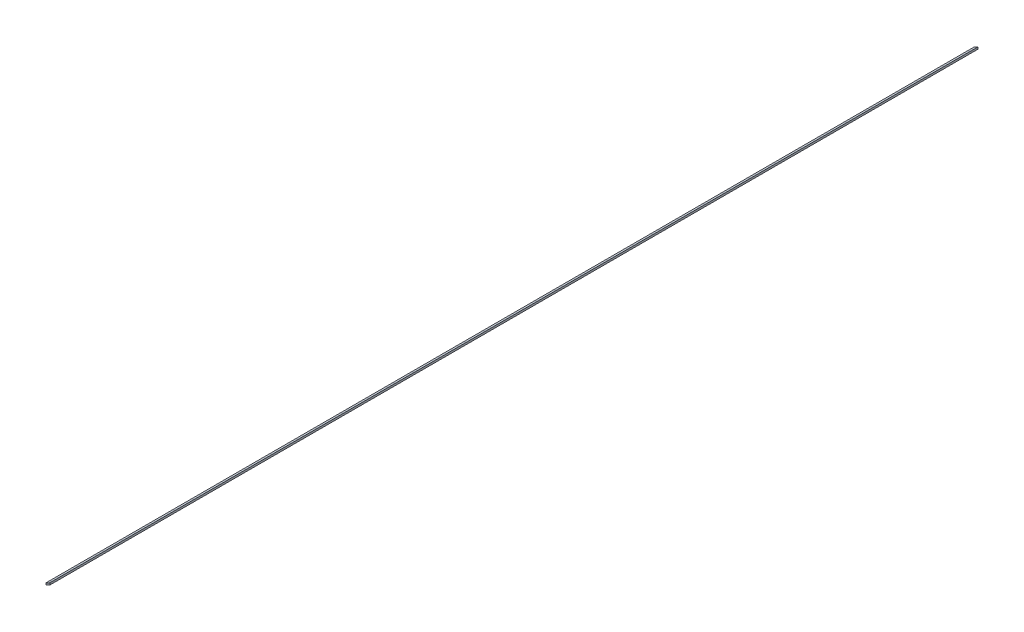
ISO-10303-21;
HEADER;
FILE_DESCRIPTION(('STEP AP214'),'2;1');
FILE_NAME('part.step','',(''),(''),'','','');
FILE_SCHEMA(('AUTOMOTIVE_DESIGN { 1 0 10303 214 1 1 1 1 }'));
ENDSEC;
DATA;
#1=APPLICATION_CONTEXT('core data for automotive mechanical design processes');
#2=APPLICATION_PROTOCOL_DEFINITION('international standard','automotive_design',2000,#1);
#3=PRODUCT_CONTEXT('',#1,'mechanical');
#4=PRODUCT('Part','Part','',(#3));
#5=PRODUCT_RELATED_PRODUCT_CATEGORY('part','',(#4));
#6=PRODUCT_DEFINITION_FORMATION('','',#4);
#7=PRODUCT_DEFINITION_CONTEXT('part definition',#1,'design');
#8=PRODUCT_DEFINITION('design','',#6,#7);
#9=PRODUCT_DEFINITION_SHAPE('','',#8);
#10=(LENGTH_UNIT() NAMED_UNIT(*) SI_UNIT(.MILLI.,.METRE.));
#11=(NAMED_UNIT(*) PLANE_ANGLE_UNIT() SI_UNIT($,.RADIAN.));
#12=(NAMED_UNIT(*) SI_UNIT($,.STERADIAN.) SOLID_ANGLE_UNIT());
#13=UNCERTAINTY_MEASURE_WITH_UNIT(LENGTH_MEASURE(1.E-05),#10,'distance_accuracy_value','');
#14=(GEOMETRIC_REPRESENTATION_CONTEXT(3) GLOBAL_UNCERTAINTY_ASSIGNED_CONTEXT((#13)) GLOBAL_UNIT_ASSIGNED_CONTEXT((#10,
#11,#12)) REPRESENTATION_CONTEXT('',''));
#15=CARTESIAN_POINT('',(0.,0.,0.));
#16=DIRECTION('',(0.,0.,1.));
#17=DIRECTION('',(1.,0.,0.));
#18=AXIS2_PLACEMENT_3D('',#15,#16,#17);
#19=CARTESIAN_POINT('',(12192.,10868.8293766007,-12192.));
#20=DIRECTION('',(0.,0.,1.));
#21=DIRECTION('',(1.,0.,0.));
#22=AXIS2_PLACEMENT_3D('',#19,#20,#21);
#23=PLANE('',#22);
#24=DIRECTION('',(0.888496348848055,0.458883686879013,0.));
#25=VECTOR('',#24,1.);
#26=CARTESIAN_POINT('',(-50.8,4572.,-12192.));
#27=LINE('',#26,#25);
#28=CARTESIAN_POINT('',(-50.8,4572.,-12192.));
#29=VERTEX_POINT('',#28);
#30=CARTESIAN_POINT('',(0.,4598.23678906917,-12192.));
#31=VERTEX_POINT('',#30);
#32=EDGE_CURVE('E88',#29,#31,#27,.T.);
#33=ORIENTED_EDGE('',*,*,#32,.T.);
#34=DIRECTION('',(0.,-1.,0.));
#35=VECTOR('',#34,1.);
#36=CARTESIAN_POINT('',(0.,50.8,-12192.));
#37=LINE('',#36,#35);
#38=CARTESIAN_POINT('',(4.7679880361686E-12,4572.,-12192.));
#39=VERTEX_POINT('',#38);
#40=EDGE_CURVE('E38',#31,#39,#37,.T.);
#41=ORIENTED_EDGE('',*,*,#40,.T.);
#42=DIRECTION('',(0.888496348848055,0.458883686879013,0.));
#43=VECTOR('',#42,1.);
#44=CARTESIAN_POINT('',(12192.,10868.8293766007,-12192.));
#45=LINE('',#44,#43);
#46=CARTESIAN_POINT('',(-50.8000000000003,4545.76321093083,-12192.));
#47=VERTEX_POINT('',#46);
#48=EDGE_CURVE('E11',#47,#39,#45,.T.);
#49=ORIENTED_EDGE('',*,*,#48,.F.);
#50=DIRECTION('',(0.,-1.,0.));
#51=VECTOR('',#50,1.);
#52=CARTESIAN_POINT('',(-50.8,0.,-12192.));
#53=LINE('',#52,#51);
#54=EDGE_CURVE('E97',#29,#47,#53,.T.);
#55=ORIENTED_EDGE('',*,*,#54,.F.);
#56=EDGE_LOOP('',(#33,#41,#49,#55));
#57=FACE_BOUND('',#56,.T.);
#58=ADVANCED_FACE('F34',(#57),#23,.F.);
#59=CARTESIAN_POINT('',(0.,50.8,-12192.));
#60=DIRECTION('',(1.,0.,0.));
#61=DIRECTION('',(0.,0.,-1.));
#62=AXIS2_PLACEMENT_3D('',#59,#60,#61);
#63=PLANE('',#62);
#64=DIRECTION('',(0.,0.,-1.));
#65=VECTOR('',#64,1.);
#66=CARTESIAN_POINT('',(0.,4598.23678906917,-26022.0350141595));
#67=LINE('',#66,#65);
#68=CARTESIAN_POINT('',(0.,4598.23678906917,0.));
#69=VERTEX_POINT('',#68);
#70=EDGE_CURVE('E59',#69,#31,#67,.T.);
#71=ORIENTED_EDGE('',*,*,#70,.F.);
#72=DIRECTION('',(0.,-1.,0.));
#73=VECTOR('',#72,1.);
#74=CARTESIAN_POINT('',(0.,50.8,0.));
#75=LINE('',#74,#73);
#76=CARTESIAN_POINT('',(0.,4572.,0.));
#77=VERTEX_POINT('',#76);
#78=EDGE_CURVE('E90',#69,#77,#75,.T.);
#79=ORIENTED_EDGE('',*,*,#78,.T.);
#80=DIRECTION('',(0.,0.,-1.));
#81=VECTOR('',#80,1.);
#82=CARTESIAN_POINT('',(0.,4572.,-12192.));
#83=LINE('',#82,#81);
#84=EDGE_CURVE('E83',#77,#39,#83,.T.);
#85=ORIENTED_EDGE('',*,*,#84,.T.);
#86=ORIENTED_EDGE('',*,*,#40,.F.);
#87=EDGE_LOOP('',(#71,#79,#85,#86));
#88=FACE_BOUND('',#87,.T.);
#89=ADVANCED_FACE('F89',(#88),#63,.T.);
#90=CARTESIAN_POINT('',(4.7679880361686E-12,4572.,-12192.));
#91=DIRECTION('',(0.458883686879013,-0.888496348848055,0.));
#92=DIRECTION('',(0.888496348848055,0.458883686879013,0.));
#93=AXIS2_PLACEMENT_3D('',#90,#91,#92);
#94=PLANE('',#93);
#95=ORIENTED_EDGE('',*,*,#84,.F.);
#96=DIRECTION('',(-0.888496348848055,-0.458883686879013,0.));
#97=VECTOR('',#96,1.);
#98=CARTESIAN_POINT('',(-1843.36775090388,3619.95175477608,0.));
#99=LINE('',#98,#97);
#100=CARTESIAN_POINT('',(-50.8,4545.76321093083,0.));
#101=VERTEX_POINT('',#100);
#102=EDGE_CURVE('E95',#77,#101,#99,.T.);
#103=ORIENTED_EDGE('',*,*,#102,.T.);
#104=DIRECTION('',(0.,0.,-1.));
#105=VECTOR('',#104,1.);
#106=CARTESIAN_POINT('',(-50.8,4545.76321093083,0.));
#107=LINE('',#106,#105);
#108=EDGE_CURVE('E84',#101,#47,#107,.T.);
#109=ORIENTED_EDGE('',*,*,#108,.T.);
#110=ORIENTED_EDGE('',*,*,#48,.T.);
#111=EDGE_LOOP('',(#95,#103,#109,#110));
#112=FACE_BOUND('',#111,.T.);
#113=ADVANCED_FACE('F80',(#112),#94,.T.);
#114=CARTESIAN_POINT('',(0.,50.8,0.));
#115=DIRECTION('',(0.,0.,-1.));
#116=DIRECTION('',(-1.,0.,0.));
#117=AXIS2_PLACEMENT_3D('',#114,#115,#116);
#118=PLANE('',#117);
#119=ORIENTED_EDGE('',*,*,#102,.F.);
#120=ORIENTED_EDGE('',*,*,#78,.F.);
#121=DIRECTION('',(-0.888496348848055,-0.458883686879013,0.));
#122=VECTOR('',#121,1.);
#123=CARTESIAN_POINT('',(-50.8,4572.,0.));
#124=LINE('',#123,#122);
#125=CARTESIAN_POINT('',(-50.8,4572.,0.));
#126=VERTEX_POINT('',#125);
#127=EDGE_CURVE('E43',#69,#126,#124,.T.);
#128=ORIENTED_EDGE('',*,*,#127,.T.);
#129=DIRECTION('',(0.,1.,0.));
#130=VECTOR('',#129,1.);
#131=CARTESIAN_POINT('',(-50.8,0.,0.));
#132=LINE('',#131,#130);
#133=EDGE_CURVE('E51',#101,#126,#132,.T.);
#134=ORIENTED_EDGE('',*,*,#133,.F.);
#135=EDGE_LOOP('',(#119,#120,#128,#134));
#136=FACE_BOUND('',#135,.T.);
#137=ADVANCED_FACE('F108',(#136),#118,.F.);
#138=CARTESIAN_POINT('',(-50.8,0.,0.));
#139=DIRECTION('',(1.,0.,0.));
#140=DIRECTION('',(0.,0.,-1.));
#141=AXIS2_PLACEMENT_3D('',#138,#139,#140);
#142=PLANE('',#141);
#143=ORIENTED_EDGE('',*,*,#108,.F.);
#144=ORIENTED_EDGE('',*,*,#133,.T.);
#145=DIRECTION('',(0.,0.,-1.));
#146=VECTOR('',#145,1.);
#147=CARTESIAN_POINT('',(-50.8,4572.,-12192.));
#148=LINE('',#147,#146);
#149=EDGE_CURVE('E99',#126,#29,#148,.T.);
#150=ORIENTED_EDGE('',*,*,#149,.T.);
#151=ORIENTED_EDGE('',*,*,#54,.T.);
#152=EDGE_LOOP('',(#143,#144,#150,#151));
#153=FACE_BOUND('',#152,.T.);
#154=ADVANCED_FACE('F103',(#153),#142,.F.);
#155=CARTESIAN_POINT('',(-50.8,4572.,-26022.0350141595));
#156=DIRECTION('',(-0.458883686879013,0.888496348848055,0.));
#157=DIRECTION('',(-0.888496348848055,-0.458883686879013,0.));
#158=AXIS2_PLACEMENT_3D('',#155,#156,#157);
#159=PLANE('',#158);
#160=ORIENTED_EDGE('',*,*,#32,.F.);
#161=ORIENTED_EDGE('',*,*,#149,.F.);
#162=ORIENTED_EDGE('',*,*,#127,.F.);
#163=ORIENTED_EDGE('',*,*,#70,.T.);
#164=EDGE_LOOP('',(#160,#161,#162,#163));
#165=FACE_BOUND('',#164,.T.);
#166=ADVANCED_FACE('F36',(#165),#159,.T.);
#167=CLOSED_SHELL('',(#58,#89,#113,#137,#154,#166));
#168=MANIFOLD_SOLID_BREP('B2',#167);
#169=ADVANCED_BREP_SHAPE_REPRESENTATION('',(#18,#168),#14);
#170=SHAPE_DEFINITION_REPRESENTATION(#9,#169);
ENDSEC;
END-ISO-10303-21;
